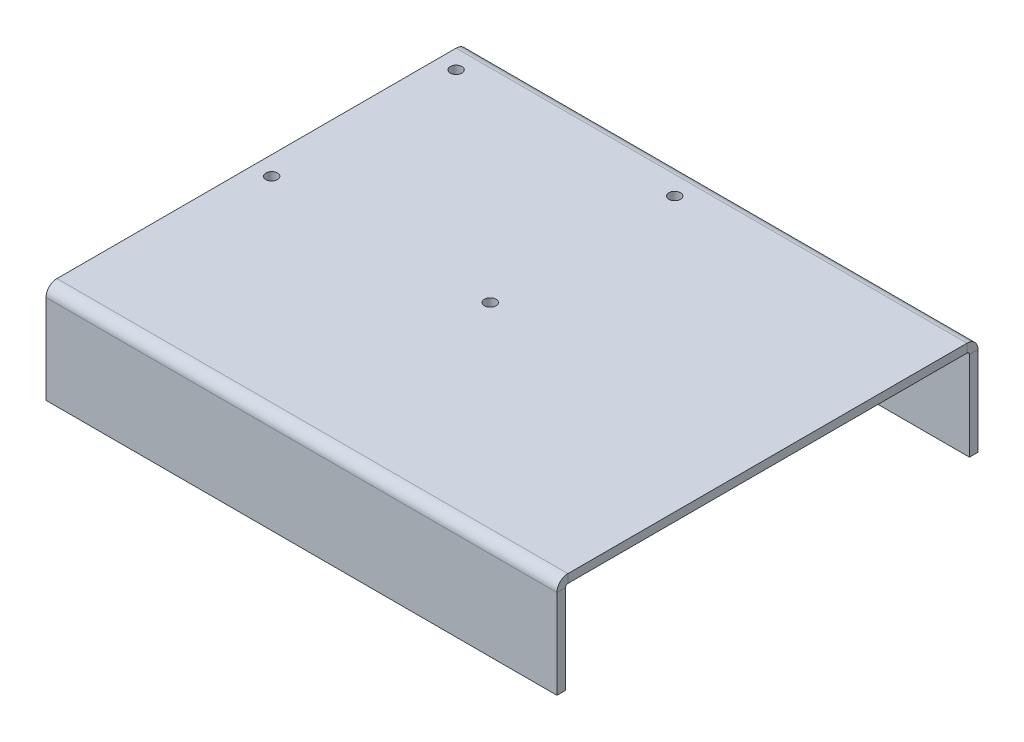
ISO-10303-21;
HEADER;
FILE_DESCRIPTION(('STEP AP214'),'2;1');
FILE_NAME('part.step','',(''),(''),'','','');
FILE_SCHEMA(('AUTOMOTIVE_DESIGN { 1 0 10303 214 1 1 1 1 }'));
ENDSEC;
DATA;
#1=APPLICATION_CONTEXT('core data for automotive mechanical design processes');
#2=APPLICATION_PROTOCOL_DEFINITION('international standard','automotive_design',2000,#1);
#3=PRODUCT_CONTEXT('',#1,'mechanical');
#4=PRODUCT('Part','Part','',(#3));
#5=PRODUCT_RELATED_PRODUCT_CATEGORY('part','',(#4));
#6=PRODUCT_DEFINITION_FORMATION('','',#4);
#7=PRODUCT_DEFINITION_CONTEXT('part definition',#1,'design');
#8=PRODUCT_DEFINITION('design','',#6,#7);
#9=PRODUCT_DEFINITION_SHAPE('','',#8);
#10=(LENGTH_UNIT() NAMED_UNIT(*) SI_UNIT(.MILLI.,.METRE.));
#11=(NAMED_UNIT(*) PLANE_ANGLE_UNIT() SI_UNIT($,.RADIAN.));
#12=(NAMED_UNIT(*) SI_UNIT($,.STERADIAN.) SOLID_ANGLE_UNIT());
#13=UNCERTAINTY_MEASURE_WITH_UNIT(LENGTH_MEASURE(1.E-05),#10,'distance_accuracy_value','');
#14=(GEOMETRIC_REPRESENTATION_CONTEXT(3) GLOBAL_UNCERTAINTY_ASSIGNED_CONTEXT((#13)) GLOBAL_UNIT_ASSIGNED_CONTEXT((#10,
#11,#12)) REPRESENTATION_CONTEXT('',''));
#15=CARTESIAN_POINT('',(0.,0.,0.));
#16=DIRECTION('',(0.,0.,1.));
#17=DIRECTION('',(1.,0.,0.));
#18=AXIS2_PLACEMENT_3D('',#15,#16,#17);
#19=CARTESIAN_POINT('',(0.,-3.175,0.));
#20=DIRECTION('',(0.,1.,0.));
#21=DIRECTION('',(0.,0.,1.));
#22=AXIS2_PLACEMENT_3D('',#19,#20,#21);
#23=PLANE('',#22);
#24=CARTESIAN_POINT('',(-88.0149999999999,-3.175,-67.2260000000001));
#25=DIRECTION('',(0.,1.,0.));
#26=DIRECTION('',(0.,0.,1.));
#27=AXIS2_PLACEMENT_3D('',#24,#25,#26);
#28=CIRCLE('',#27,2.15264999999999);
#29=CARTESIAN_POINT('',(-88.0149999999999,-3.175,-65.0733500000001));
#30=VERTEX_POINT('',#29);
#31=EDGE_CURVE('E89',#30,#30,#28,.T.);
#32=ORIENTED_EDGE('',*,*,#31,.T.);
#33=EDGE_LOOP('',(#32));
#34=FACE_BOUND('',#33,.T.);
#35=CARTESIAN_POINT('',(-6.73499999999994,-3.175,-67.2260000000001));
#36=DIRECTION('',(0.,1.,0.));
#37=DIRECTION('',(0.,0.,1.));
#38=AXIS2_PLACEMENT_3D('',#35,#36,#37);
#39=CIRCLE('',#38,2.15265);
#40=CARTESIAN_POINT('',(-6.73499999999994,-3.175,-65.0733500000001));
#41=VERTEX_POINT('',#40);
#42=EDGE_CURVE('E506',#41,#41,#39,.T.);
#43=ORIENTED_EDGE('',*,*,#42,.T.);
#44=EDGE_LOOP('',(#43));
#45=FACE_BOUND('',#44,.T.);
#46=CARTESIAN_POINT('',(-6.73499999999994,-3.175,1.35399999999995));
#47=DIRECTION('',(0.,1.,0.));
#48=DIRECTION('',(0.,0.,1.));
#49=AXIS2_PLACEMENT_3D('',#46,#47,#48);
#50=CIRCLE('',#49,2.15265);
#51=CARTESIAN_POINT('',(-6.73499999999994,-3.175,3.50664999999994));
#52=VERTEX_POINT('',#51);
#53=EDGE_CURVE('E515',#52,#52,#50,.T.);
#54=ORIENTED_EDGE('',*,*,#53,.T.);
#55=EDGE_LOOP('',(#54));
#56=FACE_BOUND('',#55,.T.);
#57=CARTESIAN_POINT('',(-88.0149999999999,-3.175,1.35399999999995));
#58=DIRECTION('',(0.,1.,0.));
#59=DIRECTION('',(0.,0.,1.));
#60=AXIS2_PLACEMENT_3D('',#57,#58,#59);
#61=CIRCLE('',#60,2.15264999999999);
#62=CARTESIAN_POINT('',(-88.0149999999999,-3.175,3.50664999999994));
#63=VERTEX_POINT('',#62);
#64=EDGE_CURVE('E218',#63,#63,#61,.T.);
#65=ORIENTED_EDGE('',*,*,#64,.T.);
#66=EDGE_LOOP('',(#65));
#67=FACE_BOUND('',#66,.T.);
#68=DIRECTION('',(1.,0.,0.));
#69=VECTOR('',#68,1.);
#70=CARTESIAN_POINT('',(95.,-3.175,-74.211));
#71=LINE('',#70,#69);
#72=CARTESIAN_POINT('',(95.,-3.175,-74.211));
#73=VERTEX_POINT('',#72);
#74=CARTESIAN_POINT('',(-95.,-3.175,-74.211));
#75=VERTEX_POINT('',#74);
#76=EDGE_CURVE('E230',#73,#75,#71,.F.);
#77=ORIENTED_EDGE('',*,*,#76,.F.);
#78=DIRECTION('',(0.,0.,-1.));
#79=VECTOR('',#78,1.);
#80=CARTESIAN_POINT('',(95.,-3.175,-75.));
#81=LINE('',#80,#79);
#82=CARTESIAN_POINT('',(95.,-3.175,74.211));
#83=VERTEX_POINT('',#82);
#84=EDGE_CURVE('E13',#83,#73,#81,.T.);
#85=ORIENTED_EDGE('',*,*,#84,.F.);
#86=DIRECTION('',(-1.,0.,0.));
#87=VECTOR('',#86,1.);
#88=CARTESIAN_POINT('',(-95.,-3.175,74.211));
#89=LINE('',#88,#87);
#90=CARTESIAN_POINT('',(-95.,-3.175,74.211));
#91=VERTEX_POINT('',#90);
#92=EDGE_CURVE('E281',#91,#83,#89,.F.);
#93=ORIENTED_EDGE('',*,*,#92,.F.);
#94=DIRECTION('',(0.,0.,1.));
#95=VECTOR('',#94,1.);
#96=CARTESIAN_POINT('',(-95.,-3.175,-75.));
#97=LINE('',#96,#95);
#98=EDGE_CURVE('E94',#75,#91,#97,.T.);
#99=ORIENTED_EDGE('',*,*,#98,.F.);
#100=EDGE_LOOP('',(#77,#85,#93,#99));
#101=FACE_BOUND('',#100,.T.);
#102=ADVANCED_FACE('F85',(#34,#45,#56,#67,#101),#23,.F.);
#103=CARTESIAN_POINT('',(0.,0.,0.));
#104=DIRECTION('',(0.,1.,0.));
#105=DIRECTION('',(0.,0.,1.));
#106=AXIS2_PLACEMENT_3D('',#103,#104,#105);
#107=PLANE('',#106);
#108=CARTESIAN_POINT('',(-88.0149999999999,0.,-67.2260000000001));
#109=DIRECTION('',(0.,1.,0.));
#110=DIRECTION('',(0.,0.,1.));
#111=AXIS2_PLACEMENT_3D('',#108,#109,#110);
#112=CIRCLE('',#111,2.15264999999999);
#113=CARTESIAN_POINT('',(-88.0149999999999,0.,-65.0733500000001));
#114=VERTEX_POINT('',#113);
#115=EDGE_CURVE('E502',#114,#114,#112,.T.);
#116=ORIENTED_EDGE('',*,*,#115,.F.);
#117=EDGE_LOOP('',(#116));
#118=FACE_BOUND('',#117,.T.);
#119=CARTESIAN_POINT('',(-6.73499999999994,0.,-67.2260000000001));
#120=DIRECTION('',(0.,1.,0.));
#121=DIRECTION('',(0.,0.,1.));
#122=AXIS2_PLACEMENT_3D('',#119,#120,#121);
#123=CIRCLE('',#122,2.15265);
#124=CARTESIAN_POINT('',(-6.73499999999994,0.,-65.0733500000001));
#125=VERTEX_POINT('',#124);
#126=EDGE_CURVE('E504',#125,#125,#123,.T.);
#127=ORIENTED_EDGE('',*,*,#126,.F.);
#128=EDGE_LOOP('',(#127));
#129=FACE_BOUND('',#128,.T.);
#130=CARTESIAN_POINT('',(-6.73499999999994,0.,1.35399999999995));
#131=DIRECTION('',(0.,1.,0.));
#132=DIRECTION('',(0.,0.,1.));
#133=AXIS2_PLACEMENT_3D('',#130,#131,#132);
#134=CIRCLE('',#133,2.15265);
#135=CARTESIAN_POINT('',(-6.73499999999994,0.,3.50664999999994));
#136=VERTEX_POINT('',#135);
#137=EDGE_CURVE('E512',#136,#136,#134,.T.);
#138=ORIENTED_EDGE('',*,*,#137,.F.);
#139=EDGE_LOOP('',(#138));
#140=FACE_BOUND('',#139,.T.);
#141=CARTESIAN_POINT('',(-88.0149999999999,0.,1.35399999999995));
#142=DIRECTION('',(0.,1.,0.));
#143=DIRECTION('',(0.,0.,1.));
#144=AXIS2_PLACEMENT_3D('',#141,#142,#143);
#145=CIRCLE('',#144,2.15264999999999);
#146=CARTESIAN_POINT('',(-88.0149999999999,0.,3.50664999999994));
#147=VERTEX_POINT('',#146);
#148=EDGE_CURVE('E518',#147,#147,#145,.T.);
#149=ORIENTED_EDGE('',*,*,#148,.F.);
#150=EDGE_LOOP('',(#149));
#151=FACE_BOUND('',#150,.T.);
#152=DIRECTION('',(0.,0.,-1.));
#153=VECTOR('',#152,1.);
#154=CARTESIAN_POINT('',(95.,0.,-75.));
#155=LINE('',#154,#153);
#156=CARTESIAN_POINT('',(95.,0.,74.211));
#157=VERTEX_POINT('',#156);
#158=CARTESIAN_POINT('',(95.,0.,-74.211));
#159=VERTEX_POINT('',#158);
#160=EDGE_CURVE('E291',#157,#159,#155,.T.);
#161=ORIENTED_EDGE('',*,*,#160,.T.);
#162=DIRECTION('',(1.,0.,0.));
#163=VECTOR('',#162,1.);
#164=CARTESIAN_POINT('',(95.,0.,-74.211));
#165=LINE('',#164,#163);
#166=CARTESIAN_POINT('',(-95.,0.,-74.211));
#167=VERTEX_POINT('',#166);
#168=EDGE_CURVE('E219',#159,#167,#165,.F.);
#169=ORIENTED_EDGE('',*,*,#168,.T.);
#170=DIRECTION('',(0.,0.,1.));
#171=VECTOR('',#170,1.);
#172=CARTESIAN_POINT('',(-95.,0.,-75.));
#173=LINE('',#172,#171);
#174=CARTESIAN_POINT('',(-95.,0.,74.211));
#175=VERTEX_POINT('',#174);
#176=EDGE_CURVE('E287',#167,#175,#173,.T.);
#177=ORIENTED_EDGE('',*,*,#176,.T.);
#178=DIRECTION('',(-1.,0.,0.));
#179=VECTOR('',#178,1.);
#180=CARTESIAN_POINT('',(-95.,0.,74.211));
#181=LINE('',#180,#179);
#182=EDGE_CURVE('E270',#175,#157,#181,.F.);
#183=ORIENTED_EDGE('',*,*,#182,.T.);
#184=EDGE_LOOP('',(#161,#169,#177,#183));
#185=FACE_BOUND('',#184,.T.);
#186=ADVANCED_FACE('F297',(#118,#129,#140,#151,#185),#107,.T.);
#187=CARTESIAN_POINT('',(95.,-3.175,-75.));
#188=DIRECTION('',(1.,0.,0.));
#189=DIRECTION('',(0.,0.,-1.));
#190=AXIS2_PLACEMENT_3D('',#187,#188,#189);
#191=PLANE('',#190);
#192=ORIENTED_EDGE('',*,*,#84,.T.);
#193=DIRECTION('',(0.,1.,0.));
#194=VECTOR('',#193,1.);
#195=CARTESIAN_POINT('',(95.,-3.175,-74.211));
#196=LINE('',#195,#194);
#197=EDGE_CURVE('E224',#73,#159,#196,.T.);
#198=ORIENTED_EDGE('',*,*,#197,.T.);
#199=ORIENTED_EDGE('',*,*,#160,.F.);
#200=DIRECTION('',(0.,1.,0.));
#201=VECTOR('',#200,1.);
#202=CARTESIAN_POINT('',(95.,-3.175,74.211));
#203=LINE('',#202,#201);
#204=EDGE_CURVE('E285',#83,#157,#203,.T.);
#205=ORIENTED_EDGE('',*,*,#204,.F.);
#206=EDGE_LOOP('',(#192,#198,#199,#205));
#207=FACE_BOUND('',#206,.T.);
#208=ADVANCED_FACE('F301',(#207),#191,.T.);
#209=CARTESIAN_POINT('',(-95.,-3.175,-75.));
#210=DIRECTION('',(-1.,0.,0.));
#211=DIRECTION('',(0.,0.,1.));
#212=AXIS2_PLACEMENT_3D('',#209,#210,#211);
#213=PLANE('',#212);
#214=DIRECTION('',(0.,1.,0.));
#215=VECTOR('',#214,1.);
#216=CARTESIAN_POINT('',(-95.,-3.175,-74.211));
#217=LINE('',#216,#215);
#218=EDGE_CURVE('E235',#75,#167,#217,.T.);
#219=ORIENTED_EDGE('',*,*,#218,.F.);
#220=ORIENTED_EDGE('',*,*,#98,.T.);
#221=DIRECTION('',(0.,1.,0.));
#222=VECTOR('',#221,1.);
#223=CARTESIAN_POINT('',(-95.,-3.175,74.211));
#224=LINE('',#223,#222);
#225=EDGE_CURVE('E275',#91,#175,#224,.T.);
#226=ORIENTED_EDGE('',*,*,#225,.T.);
#227=ORIENTED_EDGE('',*,*,#176,.F.);
#228=EDGE_LOOP('',(#219,#220,#226,#227));
#229=FACE_BOUND('',#228,.T.);
#230=ADVANCED_FACE('F87',(#229),#213,.T.);
#231=CARTESIAN_POINT('',(95.,-4.064,74.211));
#232=DIRECTION('',(1.,0.,0.));
#233=DIRECTION('',(0.,0.,-1.));
#234=AXIS2_PLACEMENT_3D('',#231,#232,#233);
#235=PLANE('',#234);
#236=DIRECTION('',(0.,0.,-1.));
#237=VECTOR('',#236,1.);
#238=CARTESIAN_POINT('',(95.,-4.064,78.275));
#239=LINE('',#238,#237);
#240=CARTESIAN_POINT('',(95.,-4.06399999999999,75.1));
#241=VERTEX_POINT('',#240);
#242=CARTESIAN_POINT('',(95.,-4.06399999999998,78.275));
#243=VERTEX_POINT('',#242);
#244=EDGE_CURVE('E237',#241,#243,#239,.F.);
#245=ORIENTED_EDGE('',*,*,#244,.F.);
#246=CARTESIAN_POINT('',(95.,-4.064,74.211));
#247=DIRECTION('',(-1.,0.,0.));
#248=DIRECTION('',(0.,0.,1.));
#249=AXIS2_PLACEMENT_3D('',#246,#247,#248);
#250=CIRCLE('',#249,0.889000000000001);
#251=EDGE_CURVE('E278',#83,#241,#250,.F.);
#252=ORIENTED_EDGE('',*,*,#251,.F.);
#253=ORIENTED_EDGE('',*,*,#204,.T.);
#254=CARTESIAN_POINT('',(95.,-4.064,74.211));
#255=DIRECTION('',(-1.,0.,0.));
#256=DIRECTION('',(0.,0.,1.));
#257=AXIS2_PLACEMENT_3D('',#254,#255,#256);
#258=CIRCLE('',#257,4.064);
#259=EDGE_CURVE('E102',#157,#243,#258,.F.);
#260=ORIENTED_EDGE('',*,*,#259,.T.);
#261=EDGE_LOOP('',(#245,#252,#253,#260));
#262=FACE_BOUND('',#261,.T.);
#263=ADVANCED_FACE('F352',(#262),#235,.T.);
#264=CARTESIAN_POINT('',(-95.,-4.064,74.211));
#265=DIRECTION('',(1.,0.,0.));
#266=DIRECTION('',(0.,0.,-1.));
#267=AXIS2_PLACEMENT_3D('',#264,#265,#266);
#268=PLANE('',#267);
#269=CARTESIAN_POINT('',(-95.,-4.064,74.211));
#270=DIRECTION('',(-1.,0.,0.));
#271=DIRECTION('',(0.,0.,1.));
#272=AXIS2_PLACEMENT_3D('',#269,#270,#271);
#273=CIRCLE('',#272,0.889000000000001);
#274=CARTESIAN_POINT('',(-95.,-4.06399999999999,75.1));
#275=VERTEX_POINT('',#274);
#276=EDGE_CURVE('E243',#275,#91,#273,.T.);
#277=ORIENTED_EDGE('',*,*,#276,.F.);
#278=DIRECTION('',(0.,0.,-1.));
#279=VECTOR('',#278,1.);
#280=CARTESIAN_POINT('',(-95.,-4.064,75.1));
#281=LINE('',#280,#279);
#282=CARTESIAN_POINT('',(-95.,-4.064,78.275));
#283=VERTEX_POINT('',#282);
#284=EDGE_CURVE('E263',#275,#283,#281,.F.);
#285=ORIENTED_EDGE('',*,*,#284,.T.);
#286=CARTESIAN_POINT('',(-95.,-4.064,74.211));
#287=DIRECTION('',(-1.,0.,0.));
#288=DIRECTION('',(0.,0.,1.));
#289=AXIS2_PLACEMENT_3D('',#286,#287,#288);
#290=CIRCLE('',#289,4.064);
#291=EDGE_CURVE('E273',#283,#175,#290,.T.);
#292=ORIENTED_EDGE('',*,*,#291,.T.);
#293=ORIENTED_EDGE('',*,*,#225,.F.);
#294=EDGE_LOOP('',(#277,#285,#292,#293));
#295=FACE_BOUND('',#294,.T.);
#296=ADVANCED_FACE('F346',(#295),#268,.F.);
#297=CARTESIAN_POINT('',(-95.,-4.064,74.211));
#298=DIRECTION('',(-1.,0.,0.));
#299=DIRECTION('',(0.,0.,1.));
#300=AXIS2_PLACEMENT_3D('',#297,#298,#299);
#301=CYLINDRICAL_SURFACE('',#300,4.064);
#302=ORIENTED_EDGE('',*,*,#182,.F.);
#303=ORIENTED_EDGE('',*,*,#291,.F.);
#304=DIRECTION('',(-1.,0.,0.));
#305=VECTOR('',#304,1.);
#306=CARTESIAN_POINT('',(95.,-4.064,78.275));
#307=LINE('',#306,#305);
#308=EDGE_CURVE('E261',#283,#243,#307,.F.);
#309=ORIENTED_EDGE('',*,*,#308,.T.);
#310=ORIENTED_EDGE('',*,*,#259,.F.);
#311=EDGE_LOOP('',(#302,#303,#309,#310));
#312=FACE_BOUND('',#311,.T.);
#313=ADVANCED_FACE('F360',(#312),#301,.T.);
#314=CARTESIAN_POINT('',(-95.,-4.064,74.211));
#315=DIRECTION('',(-1.,0.,0.));
#316=DIRECTION('',(0.,0.,1.));
#317=AXIS2_PLACEMENT_3D('',#314,#315,#316);
#318=CYLINDRICAL_SURFACE('',#317,0.889000000000001);
#319=ORIENTED_EDGE('',*,*,#92,.T.);
#320=ORIENTED_EDGE('',*,*,#251,.T.);
#321=DIRECTION('',(-1.,0.,0.));
#322=VECTOR('',#321,1.);
#323=CARTESIAN_POINT('',(95.,-4.064,75.1));
#324=LINE('',#323,#322);
#325=EDGE_CURVE('E266',#241,#275,#324,.T.);
#326=ORIENTED_EDGE('',*,*,#325,.T.);
#327=ORIENTED_EDGE('',*,*,#276,.T.);
#328=EDGE_LOOP('',(#319,#320,#326,#327));
#329=FACE_BOUND('',#328,.T.);
#330=ADVANCED_FACE('F363',(#329),#318,.F.);
#331=CARTESIAN_POINT('',(-95.,-37.175,78.2750000000001));
#332=DIRECTION('',(1.,0.,0.));
#333=DIRECTION('',(0.,1.,0.));
#334=AXIS2_PLACEMENT_3D('',#331,#332,#333);
#335=PLANE('',#334);
#336=ORIENTED_EDGE('',*,*,#284,.F.);
#337=DIRECTION('',(0.,1.,0.));
#338=VECTOR('',#337,1.);
#339=CARTESIAN_POINT('',(-95.,-37.175,75.1000000000001));
#340=LINE('',#339,#338);
#341=CARTESIAN_POINT('',(-95.,-37.175,75.1000000000001));
#342=VERTEX_POINT('',#341);
#343=EDGE_CURVE('E259',#275,#342,#340,.F.);
#344=ORIENTED_EDGE('',*,*,#343,.T.);
#345=DIRECTION('',(0.,0.,-1.));
#346=VECTOR('',#345,1.);
#347=CARTESIAN_POINT('',(-95.,-37.175,78.2750000000001));
#348=LINE('',#347,#346);
#349=CARTESIAN_POINT('',(-95.,-37.175,78.2750000000001));
#350=VERTEX_POINT('',#349);
#351=EDGE_CURVE('E240',#350,#342,#348,.T.);
#352=ORIENTED_EDGE('',*,*,#351,.F.);
#353=DIRECTION('',(0.,-1.,0.));
#354=VECTOR('',#353,1.);
#355=CARTESIAN_POINT('',(-95.,3.2537653007486E-13,78.275));
#356=LINE('',#355,#354);
#357=EDGE_CURVE('E252',#283,#350,#356,.T.);
#358=ORIENTED_EDGE('',*,*,#357,.F.);
#359=EDGE_LOOP('',(#336,#344,#352,#358));
#360=FACE_BOUND('',#359,.T.);
#361=ADVANCED_FACE('F366',(#360),#335,.F.);
#362=CARTESIAN_POINT('',(95.,-3.17499999999999,78.275));
#363=DIRECTION('',(-1.,0.,0.));
#364=DIRECTION('',(0.,0.,1.));
#365=AXIS2_PLACEMENT_3D('',#362,#363,#364);
#366=PLANE('',#365);
#367=ORIENTED_EDGE('',*,*,#244,.T.);
#368=DIRECTION('',(0.,1.,0.));
#369=VECTOR('',#368,1.);
#370=CARTESIAN_POINT('',(95.,2.86600358258908E-13,78.275));
#371=LINE('',#370,#369);
#372=CARTESIAN_POINT('',(95.,-37.175,78.2750000000001));
#373=VERTEX_POINT('',#372);
#374=EDGE_CURVE('E247',#373,#243,#371,.T.);
#375=ORIENTED_EDGE('',*,*,#374,.F.);
#376=DIRECTION('',(0.,0.,-1.));
#377=VECTOR('',#376,1.);
#378=CARTESIAN_POINT('',(95.,-37.175,78.2750000000001));
#379=LINE('',#378,#377);
#380=CARTESIAN_POINT('',(95.,-37.175,75.1000000000001));
#381=VERTEX_POINT('',#380);
#382=EDGE_CURVE('E244',#373,#381,#379,.T.);
#383=ORIENTED_EDGE('',*,*,#382,.T.);
#384=DIRECTION('',(0.,-1.,0.));
#385=VECTOR('',#384,1.);
#386=CARTESIAN_POINT('',(95.,-3.175,75.1));
#387=LINE('',#386,#385);
#388=EDGE_CURVE('E254',#381,#241,#387,.F.);
#389=ORIENTED_EDGE('',*,*,#388,.T.);
#390=EDGE_LOOP('',(#367,#375,#383,#389));
#391=FACE_BOUND('',#390,.T.);
#392=ADVANCED_FACE('F372',(#391),#366,.F.);
#393=CARTESIAN_POINT('',(0.,2.86600358258908E-13,78.275));
#394=DIRECTION('',(0.,0.,-1.));
#395=DIRECTION('',(0.,1.,0.));
#396=AXIS2_PLACEMENT_3D('',#393,#394,#395);
#397=PLANE('',#396);
#398=ORIENTED_EDGE('',*,*,#308,.F.);
#399=ORIENTED_EDGE('',*,*,#357,.T.);
#400=DIRECTION('',(1.,0.,0.));
#401=VECTOR('',#400,1.);
#402=CARTESIAN_POINT('',(0.,-37.175,78.2750000000001));
#403=LINE('',#402,#401);
#404=EDGE_CURVE('E250',#350,#373,#403,.T.);
#405=ORIENTED_EDGE('',*,*,#404,.T.);
#406=ORIENTED_EDGE('',*,*,#374,.T.);
#407=EDGE_LOOP('',(#398,#399,#405,#406));
#408=FACE_BOUND('',#407,.T.);
#409=ADVANCED_FACE('F381',(#408),#397,.F.);
#410=CARTESIAN_POINT('',(0.,2.75514905008081E-13,75.1));
#411=DIRECTION('',(0.,0.,-1.));
#412=DIRECTION('',(0.,1.,0.));
#413=AXIS2_PLACEMENT_3D('',#410,#411,#412);
#414=PLANE('',#413);
#415=ORIENTED_EDGE('',*,*,#343,.F.);
#416=ORIENTED_EDGE('',*,*,#325,.F.);
#417=ORIENTED_EDGE('',*,*,#388,.F.);
#418=DIRECTION('',(-1.,0.,0.));
#419=VECTOR('',#418,1.);
#420=CARTESIAN_POINT('',(95.,-37.175,75.1000000000001));
#421=LINE('',#420,#419);
#422=EDGE_CURVE('E257',#342,#381,#421,.F.);
#423=ORIENTED_EDGE('',*,*,#422,.F.);
#424=EDGE_LOOP('',(#415,#416,#417,#423));
#425=FACE_BOUND('',#424,.T.);
#426=ADVANCED_FACE('F377',(#425),#414,.T.);
#427=CARTESIAN_POINT('',(95.,-37.175,78.2750000000001));
#428=DIRECTION('',(0.,1.,0.));
#429=DIRECTION('',(0.,0.,1.));
#430=AXIS2_PLACEMENT_3D('',#427,#428,#429);
#431=PLANE('',#430);
#432=ORIENTED_EDGE('',*,*,#422,.T.);
#433=ORIENTED_EDGE('',*,*,#382,.F.);
#434=ORIENTED_EDGE('',*,*,#404,.F.);
#435=ORIENTED_EDGE('',*,*,#351,.T.);
#436=EDGE_LOOP('',(#432,#433,#434,#435));
#437=FACE_BOUND('',#436,.T.);
#438=ADVANCED_FACE('F374',(#437),#431,.F.);
#439=CARTESIAN_POINT('',(-95.,-4.064,-74.211));
#440=DIRECTION('',(-1.,0.,0.));
#441=DIRECTION('',(0.,0.,1.));
#442=AXIS2_PLACEMENT_3D('',#439,#440,#441);
#443=PLANE('',#442);
#444=DIRECTION('',(0.,0.,1.));
#445=VECTOR('',#444,1.);
#446=CARTESIAN_POINT('',(-95.,-4.06399999999998,-78.275));
#447=LINE('',#446,#445);
#448=CARTESIAN_POINT('',(-95.,-4.064,-75.1));
#449=VERTEX_POINT('',#448);
#450=CARTESIAN_POINT('',(-95.,-4.06399999999999,-78.275));
#451=VERTEX_POINT('',#450);
#452=EDGE_CURVE('E200',#449,#451,#447,.F.);
#453=ORIENTED_EDGE('',*,*,#452,.F.);
#454=CARTESIAN_POINT('',(-95.,-4.064,-74.211));
#455=DIRECTION('',(1.,0.,0.));
#456=DIRECTION('',(0.,0.,-1.));
#457=AXIS2_PLACEMENT_3D('',#454,#455,#456);
#458=CIRCLE('',#457,0.889000000000001);
#459=EDGE_CURVE('E227',#75,#449,#458,.F.);
#460=ORIENTED_EDGE('',*,*,#459,.F.);
#461=ORIENTED_EDGE('',*,*,#218,.T.);
#462=CARTESIAN_POINT('',(-95.,-4.064,-74.211));
#463=DIRECTION('',(1.,0.,0.));
#464=DIRECTION('',(0.,0.,-1.));
#465=AXIS2_PLACEMENT_3D('',#462,#463,#464);
#466=CIRCLE('',#465,4.064);
#467=EDGE_CURVE('E110',#167,#451,#466,.F.);
#468=ORIENTED_EDGE('',*,*,#467,.T.);
#469=EDGE_LOOP('',(#453,#460,#461,#468));
#470=FACE_BOUND('',#469,.T.);
#471=ADVANCED_FACE('F318',(#470),#443,.T.);
#472=CARTESIAN_POINT('',(95.,-4.064,-74.211));
#473=DIRECTION('',(-1.,0.,0.));
#474=DIRECTION('',(0.,0.,1.));
#475=AXIS2_PLACEMENT_3D('',#472,#473,#474);
#476=PLANE('',#475);
#477=CARTESIAN_POINT('',(95.,-4.064,-74.211));
#478=DIRECTION('',(1.,0.,0.));
#479=DIRECTION('',(0.,0.,-1.));
#480=AXIS2_PLACEMENT_3D('',#477,#478,#479);
#481=CIRCLE('',#480,0.889000000000001);
#482=CARTESIAN_POINT('',(95.,-4.064,-75.1));
#483=VERTEX_POINT('',#482);
#484=EDGE_CURVE('E232',#483,#73,#481,.T.);
#485=ORIENTED_EDGE('',*,*,#484,.F.);
#486=DIRECTION('',(0.,0.,1.));
#487=VECTOR('',#486,1.);
#488=CARTESIAN_POINT('',(95.,-4.064,-75.1));
#489=LINE('',#488,#487);
#490=CARTESIAN_POINT('',(95.,-4.06399999999998,-78.275));
#491=VERTEX_POINT('',#490);
#492=EDGE_CURVE('E212',#483,#491,#489,.F.);
#493=ORIENTED_EDGE('',*,*,#492,.T.);
#494=CARTESIAN_POINT('',(95.,-4.064,-74.211));
#495=DIRECTION('',(1.,0.,0.));
#496=DIRECTION('',(0.,0.,-1.));
#497=AXIS2_PLACEMENT_3D('',#494,#495,#496);
#498=CIRCLE('',#497,4.064);
#499=EDGE_CURVE('E222',#491,#159,#498,.T.);
#500=ORIENTED_EDGE('',*,*,#499,.T.);
#501=ORIENTED_EDGE('',*,*,#197,.F.);
#502=EDGE_LOOP('',(#485,#493,#500,#501));
#503=FACE_BOUND('',#502,.T.);
#504=ADVANCED_FACE('F305',(#503),#476,.F.);
#505=CARTESIAN_POINT('',(95.,-4.064,-74.211));
#506=DIRECTION('',(1.,0.,0.));
#507=DIRECTION('',(0.,0.,-1.));
#508=AXIS2_PLACEMENT_3D('',#505,#506,#507);
#509=CYLINDRICAL_SURFACE('',#508,4.064);
#510=ORIENTED_EDGE('',*,*,#168,.F.);
#511=ORIENTED_EDGE('',*,*,#499,.F.);
#512=DIRECTION('',(1.,0.,0.));
#513=VECTOR('',#512,1.);
#514=CARTESIAN_POINT('',(-95.,-4.06399999999998,-78.275));
#515=LINE('',#514,#513);
#516=EDGE_CURVE('E210',#491,#451,#515,.F.);
#517=ORIENTED_EDGE('',*,*,#516,.T.);
#518=ORIENTED_EDGE('',*,*,#467,.F.);
#519=EDGE_LOOP('',(#510,#511,#517,#518));
#520=FACE_BOUND('',#519,.T.);
#521=ADVANCED_FACE('F324',(#520),#509,.T.);
#522=CARTESIAN_POINT('',(95.,-4.064,-74.211));
#523=DIRECTION('',(1.,0.,0.));
#524=DIRECTION('',(0.,0.,-1.));
#525=AXIS2_PLACEMENT_3D('',#522,#523,#524);
#526=CYLINDRICAL_SURFACE('',#525,0.889000000000001);
#527=ORIENTED_EDGE('',*,*,#76,.T.);
#528=ORIENTED_EDGE('',*,*,#459,.T.);
#529=DIRECTION('',(1.,0.,0.));
#530=VECTOR('',#529,1.);
#531=CARTESIAN_POINT('',(-95.,-4.064,-75.1));
#532=LINE('',#531,#530);
#533=EDGE_CURVE('E215',#449,#483,#532,.T.);
#534=ORIENTED_EDGE('',*,*,#533,.T.);
#535=ORIENTED_EDGE('',*,*,#484,.T.);
#536=EDGE_LOOP('',(#527,#528,#534,#535));
#537=FACE_BOUND('',#536,.T.);
#538=ADVANCED_FACE('F309',(#537),#526,.F.);
#539=CARTESIAN_POINT('',(95.,-37.175,-78.2750000000001));
#540=DIRECTION('',(-1.,0.,0.));
#541=DIRECTION('',(0.,0.,1.));
#542=AXIS2_PLACEMENT_3D('',#539,#540,#541);
#543=PLANE('',#542);
#544=ORIENTED_EDGE('',*,*,#492,.F.);
#545=DIRECTION('',(0.,1.,0.));
#546=VECTOR('',#545,1.);
#547=CARTESIAN_POINT('',(95.,-37.175,-75.1000000000001));
#548=LINE('',#547,#546);
#549=CARTESIAN_POINT('',(95.,-37.175,-75.1000000000001));
#550=VERTEX_POINT('',#549);
#551=EDGE_CURVE('E208',#483,#550,#548,.F.);
#552=ORIENTED_EDGE('',*,*,#551,.T.);
#553=DIRECTION('',(0.,0.,1.));
#554=VECTOR('',#553,1.);
#555=CARTESIAN_POINT('',(95.,-37.175,-78.2750000000001));
#556=LINE('',#555,#554);
#557=CARTESIAN_POINT('',(95.,-37.175,-78.2750000000001));
#558=VERTEX_POINT('',#557);
#559=EDGE_CURVE('E196',#558,#550,#556,.T.);
#560=ORIENTED_EDGE('',*,*,#559,.F.);
#561=DIRECTION('',(0.,-1.,0.));
#562=VECTOR('',#561,1.);
#563=CARTESIAN_POINT('',(95.,2.86600358258908E-13,-78.275));
#564=LINE('',#563,#562);
#565=EDGE_CURVE('E183',#491,#558,#564,.T.);
#566=ORIENTED_EDGE('',*,*,#565,.F.);
#567=EDGE_LOOP('',(#544,#552,#560,#566));
#568=FACE_BOUND('',#567,.T.);
#569=ADVANCED_FACE('F323',(#568),#543,.F.);
#570=CARTESIAN_POINT('',(-95.,-3.17499999999999,-78.275));
#571=DIRECTION('',(1.,0.,0.));
#572=DIRECTION('',(0.,0.,-1.));
#573=AXIS2_PLACEMENT_3D('',#570,#571,#572);
#574=PLANE('',#573);
#575=ORIENTED_EDGE('',*,*,#452,.T.);
#576=DIRECTION('',(0.,1.,0.));
#577=VECTOR('',#576,1.);
#578=CARTESIAN_POINT('',(-95.,2.86600358258908E-13,-78.275));
#579=LINE('',#578,#577);
#580=CARTESIAN_POINT('',(-95.,-37.175,-78.2750000000001));
#581=VERTEX_POINT('',#580);
#582=EDGE_CURVE('E181',#581,#451,#579,.T.);
#583=ORIENTED_EDGE('',*,*,#582,.F.);
#584=DIRECTION('',(0.,0.,1.));
#585=VECTOR('',#584,1.);
#586=CARTESIAN_POINT('',(-95.,-37.175,-78.2750000000001));
#587=LINE('',#586,#585);
#588=CARTESIAN_POINT('',(-95.,-37.175,-75.1000000000001));
#589=VERTEX_POINT('',#588);
#590=EDGE_CURVE('E189',#581,#589,#587,.T.);
#591=ORIENTED_EDGE('',*,*,#590,.T.);
#592=DIRECTION('',(0.,-1.,0.));
#593=VECTOR('',#592,1.);
#594=CARTESIAN_POINT('',(-95.,-3.175,-75.1));
#595=LINE('',#594,#593);
#596=EDGE_CURVE('E205',#589,#449,#595,.F.);
#597=ORIENTED_EDGE('',*,*,#596,.T.);
#598=EDGE_LOOP('',(#575,#583,#591,#597));
#599=FACE_BOUND('',#598,.T.);
#600=ADVANCED_FACE('F199',(#599),#574,.F.);
#601=CARTESIAN_POINT('',(0.,2.86600358258908E-13,-78.275));
#602=DIRECTION('',(0.,0.,1.));
#603=DIRECTION('',(0.,-1.,0.));
#604=AXIS2_PLACEMENT_3D('',#601,#602,#603);
#605=PLANE('',#604);
#606=ORIENTED_EDGE('',*,*,#516,.F.);
#607=ORIENTED_EDGE('',*,*,#565,.T.);
#608=DIRECTION('',(-1.,0.,0.));
#609=VECTOR('',#608,1.);
#610=CARTESIAN_POINT('',(0.,-37.175,-78.2750000000001));
#611=LINE('',#610,#609);
#612=EDGE_CURVE('E176',#558,#581,#611,.T.);
#613=ORIENTED_EDGE('',*,*,#612,.T.);
#614=ORIENTED_EDGE('',*,*,#582,.T.);
#615=EDGE_LOOP('',(#606,#607,#613,#614));
#616=FACE_BOUND('',#615,.T.);
#617=ADVANCED_FACE('F179',(#616),#605,.F.);
#618=CARTESIAN_POINT('',(0.,2.75514905008081E-13,-75.1));
#619=DIRECTION('',(0.,0.,1.));
#620=DIRECTION('',(0.,-1.,0.));
#621=AXIS2_PLACEMENT_3D('',#618,#619,#620);
#622=PLANE('',#621);
#623=ORIENTED_EDGE('',*,*,#551,.F.);
#624=ORIENTED_EDGE('',*,*,#533,.F.);
#625=ORIENTED_EDGE('',*,*,#596,.F.);
#626=DIRECTION('',(1.,0.,0.));
#627=VECTOR('',#626,1.);
#628=CARTESIAN_POINT('',(-95.,-37.175,-75.1000000000001));
#629=LINE('',#628,#627);
#630=EDGE_CURVE('E192',#550,#589,#629,.F.);
#631=ORIENTED_EDGE('',*,*,#630,.F.);
#632=EDGE_LOOP('',(#623,#624,#625,#631));
#633=FACE_BOUND('',#632,.T.);
#634=ADVANCED_FACE('F321',(#633),#622,.T.);
#635=CARTESIAN_POINT('',(-95.,-37.175,-78.2750000000001));
#636=DIRECTION('',(0.,1.,0.));
#637=DIRECTION('',(0.,0.,1.));
#638=AXIS2_PLACEMENT_3D('',#635,#636,#637);
#639=PLANE('',#638);
#640=ORIENTED_EDGE('',*,*,#630,.T.);
#641=ORIENTED_EDGE('',*,*,#590,.F.);
#642=ORIENTED_EDGE('',*,*,#612,.F.);
#643=ORIENTED_EDGE('',*,*,#559,.T.);
#644=EDGE_LOOP('',(#640,#641,#642,#643));
#645=FACE_BOUND('',#644,.T.);
#646=ADVANCED_FACE('F190',(#645),#639,.F.);
#647=CARTESIAN_POINT('',(-88.0149999999999,0.,1.35399999999995));
#648=DIRECTION('',(0.,1.,0.));
#649=DIRECTION('',(0.,0.,1.));
#650=AXIS2_PLACEMENT_3D('',#647,#648,#649);
#651=CYLINDRICAL_SURFACE('',#650,2.15264999999999);
#652=ORIENTED_EDGE('',*,*,#148,.T.);
#653=EDGE_LOOP('',(#652));
#654=FACE_BOUND('',#653,.T.);
#655=ORIENTED_EDGE('',*,*,#64,.F.);
#656=EDGE_LOOP('',(#655));
#657=FACE_BOUND('',#656,.T.);
#658=ADVANCED_FACE('F456',(#654,#657),#651,.F.);
#659=CARTESIAN_POINT('',(-6.73499999999994,0.,1.35399999999995));
#660=DIRECTION('',(0.,1.,0.));
#661=DIRECTION('',(0.,0.,1.));
#662=AXIS2_PLACEMENT_3D('',#659,#660,#661);
#663=CYLINDRICAL_SURFACE('',#662,2.15265);
#664=ORIENTED_EDGE('',*,*,#137,.T.);
#665=EDGE_LOOP('',(#664));
#666=FACE_BOUND('',#665,.T.);
#667=ORIENTED_EDGE('',*,*,#53,.F.);
#668=EDGE_LOOP('',(#667));
#669=FACE_BOUND('',#668,.T.);
#670=ADVANCED_FACE('F466',(#666,#669),#663,.F.);
#671=CARTESIAN_POINT('',(-6.73499999999994,0.,-67.2260000000001));
#672=DIRECTION('',(0.,1.,0.));
#673=DIRECTION('',(0.,0.,1.));
#674=AXIS2_PLACEMENT_3D('',#671,#672,#673);
#675=CYLINDRICAL_SURFACE('',#674,2.15265);
#676=ORIENTED_EDGE('',*,*,#126,.T.);
#677=EDGE_LOOP('',(#676));
#678=FACE_BOUND('',#677,.T.);
#679=ORIENTED_EDGE('',*,*,#42,.F.);
#680=EDGE_LOOP('',(#679));
#681=FACE_BOUND('',#680,.T.);
#682=ADVANCED_FACE('F476',(#678,#681),#675,.F.);
#683=CARTESIAN_POINT('',(-88.0149999999999,0.,-67.2260000000001));
#684=DIRECTION('',(0.,1.,0.));
#685=DIRECTION('',(0.,0.,1.));
#686=AXIS2_PLACEMENT_3D('',#683,#684,#685);
#687=CYLINDRICAL_SURFACE('',#686,2.15264999999999);
#688=ORIENTED_EDGE('',*,*,#115,.T.);
#689=EDGE_LOOP('',(#688));
#690=FACE_BOUND('',#689,.T.);
#691=ORIENTED_EDGE('',*,*,#31,.F.);
#692=EDGE_LOOP('',(#691));
#693=FACE_BOUND('',#692,.T.);
#694=ADVANCED_FACE('F486',(#690,#693),#687,.F.);
#695=CLOSED_SHELL('',(#102,#186,#208,#230,#263,#296,#313,#330,#361,#392,#409,#426,#438,#471,
#504,#521,#538,#569,#600,#617,#634,#646,#658,#670,#682,#694));
#696=MANIFOLD_SOLID_BREP('B2',#695);
#697=ADVANCED_BREP_SHAPE_REPRESENTATION('',(#18,#696),#14);
#698=SHAPE_DEFINITION_REPRESENTATION(#9,#697);
ENDSEC;
END-ISO-10303-21;
